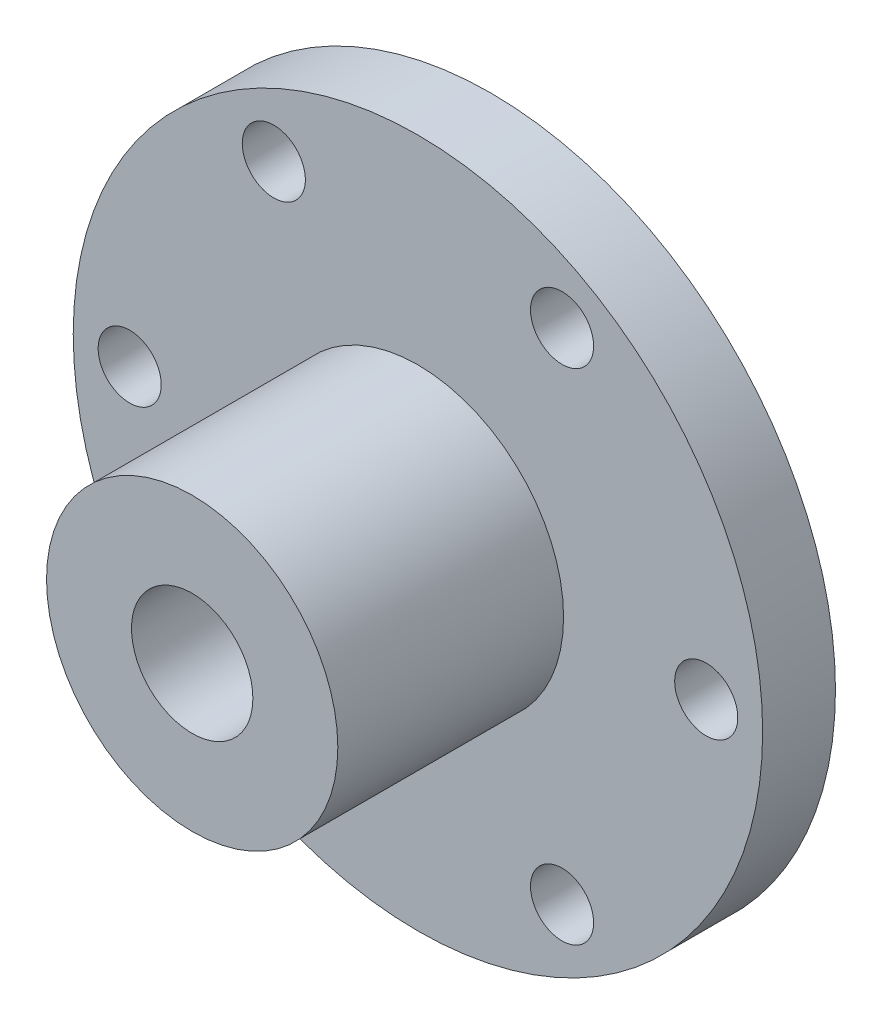
ISO-10303-21;
HEADER;
FILE_DESCRIPTION(('STEP AP214'),'2;1');
FILE_NAME('part.step','',(''),(''),'','','');
FILE_SCHEMA(('AUTOMOTIVE_DESIGN { 1 0 10303 214 1 1 1 1 }'));
ENDSEC;
DATA;
#1=APPLICATION_CONTEXT('core data for automotive mechanical design processes');
#2=APPLICATION_PROTOCOL_DEFINITION('international standard','automotive_design',2000,#1);
#3=PRODUCT_CONTEXT('',#1,'mechanical');
#4=PRODUCT('Part','Part','',(#3));
#5=PRODUCT_RELATED_PRODUCT_CATEGORY('part','',(#4));
#6=PRODUCT_DEFINITION_FORMATION('','',#4);
#7=PRODUCT_DEFINITION_CONTEXT('part definition',#1,'design');
#8=PRODUCT_DEFINITION('design','',#6,#7);
#9=PRODUCT_DEFINITION_SHAPE('','',#8);
#10=(LENGTH_UNIT() NAMED_UNIT(*) SI_UNIT(.MILLI.,.METRE.));
#11=(NAMED_UNIT(*) PLANE_ANGLE_UNIT() SI_UNIT($,.RADIAN.));
#12=(NAMED_UNIT(*) SI_UNIT($,.STERADIAN.) SOLID_ANGLE_UNIT());
#13=UNCERTAINTY_MEASURE_WITH_UNIT(LENGTH_MEASURE(1.E-05),#10,'distance_accuracy_value','');
#14=(GEOMETRIC_REPRESENTATION_CONTEXT(3) GLOBAL_UNCERTAINTY_ASSIGNED_CONTEXT((#13)) GLOBAL_UNIT_ASSIGNED_CONTEXT((#10,
#11,#12)) REPRESENTATION_CONTEXT('',''));
#15=CARTESIAN_POINT('',(0.,0.,0.));
#16=DIRECTION('',(0.,0.,1.));
#17=DIRECTION('',(1.,0.,0.));
#18=AXIS2_PLACEMENT_3D('',#15,#16,#17);
#19=CARTESIAN_POINT('',(0.,0.,0.));
#20=DIRECTION('',(0.,0.,1.));
#21=DIRECTION('',(1.,0.,0.));
#22=AXIS2_PLACEMENT_3D('',#19,#20,#21);
#23=CYLINDRICAL_SURFACE('',#22,5.);
#24=CARTESIAN_POINT('',(0.,-5.,-7.45));
#25=CARTESIAN_POINT('',(0.142778987258238,-4.99999039844045,-7.45001096175151));
#26=CARTESIAN_POINT('',(0.285680641912043,-4.99382130262224,-7.46118493256251));
#27=CARTESIAN_POINT('',(0.567144564535995,-4.96974680203863,-7.50533650142499));
#28=CARTESIAN_POINT('',(0.705700638438619,-4.95182537743962,-7.53834386153926));
#29=CARTESIAN_POINT('',(0.974002318355807,-4.90609520595076,-7.62442420915791));
#30=CARTESIAN_POINT('',(1.10378166320061,-4.87832722648994,-7.67741451835656));
#31=CARTESIAN_POINT('',(1.35234717564264,-4.81535273161602,-7.80146455965426));
#32=CARTESIAN_POINT('',(1.47113287328393,-4.78014589841814,-7.87252506373098));
#33=CARTESIAN_POINT('',(1.70352686090178,-4.70255423205703,-8.0361916310851));
#34=CARTESIAN_POINT('',(1.81621688111275,-4.65984222371037,-8.12994355837125));
#35=CARTESIAN_POINT('',(2.02514431220465,-4.57292248847482,-8.33382166528694));
#36=CARTESIAN_POINT('',(2.12136634262729,-4.52871340903373,-8.44396297444854));
#37=CARTESIAN_POINT('',(2.30419697448828,-4.43869864347795,-8.69036710384133));
#38=CARTESIAN_POINT('',(2.38892451399576,-4.39316476080857,-8.828134362448));
#39=CARTESIAN_POINT('',(2.53369890505088,-4.31130412463234,-9.11874948657494));
#40=CARTESIAN_POINT('',(2.5937652583839,-4.2749701047281,-9.27158531695978));
#41=CARTESIAN_POINT('',(2.66155878256045,-4.23281682608562,-9.50386693192337));
#42=CARTESIAN_POINT('',(2.68014299981511,-4.2210380825709,-9.57919926037609));
#43=CARTESIAN_POINT('',(2.71093428147607,-4.20133009671399,-9.73163327698794));
#44=CARTESIAN_POINT('',(2.72314510987524,-4.1933985824731,-9.80873389267935));
#45=CARTESIAN_POINT('',(2.74096165815425,-4.18177527979981,-9.96394064551219));
#46=CARTESIAN_POINT('',(2.74657370906037,-4.17807942765737,-10.042045746056));
#47=CARTESIAN_POINT('',(2.75111459464714,-4.17508903260052,-10.1985073573553));
#48=CARTESIAN_POINT('',(2.75004434358443,-4.17579388759184,-10.2768638322522));
#49=CARTESIAN_POINT('',(2.73815212102398,-4.18361720654724,-10.487283317475));
#50=CARTESIAN_POINT('',(2.72108205584888,-4.19484451675383,-10.6189068407935));
#51=CARTESIAN_POINT('',(2.66864788710094,-4.22838592901145,-10.8769084684328));
#52=CARTESIAN_POINT('',(2.63327545089908,-4.25070508072784,-11.0032841552061));
#53=CARTESIAN_POINT('',(2.54479294297974,-4.30427056272792,-11.2507966486315));
#54=CARTESIAN_POINT('',(2.49131692713376,-4.33569897011437,-11.3717617857524));
#55=CARTESIAN_POINT('',(2.36845745747105,-4.4040145794537,-11.6036203124031));
#56=CARTESIAN_POINT('',(2.29906713742857,-4.44090413517624,-11.7145093256733));
#57=CARTESIAN_POINT('',(2.13363906053041,-4.52298416705886,-11.9414906618093));
#58=CARTESIAN_POINT('',(2.03512428066292,-4.56856599345175,-12.0556432467646));
#59=CARTESIAN_POINT('',(1.82040889583878,-4.65828959035832,-12.2667111409128));
#60=CARTESIAN_POINT('',(1.70419629159628,-4.7024303589756,-12.3636146576635));
#61=CARTESIAN_POINT('',(1.44767506202423,-4.78786891297331,-12.5436913267541));
#62=CARTESIAN_POINT('',(1.30627310030775,-4.82877747246816,-12.6255077204941));
#63=CARTESIAN_POINT('',(1.00892063152072,-4.89952546955727,-12.7634679362701));
#64=CARTESIAN_POINT('',(0.852983969474416,-4.92937530895885,-12.8196358947936));
#65=CARTESIAN_POINT('',(0.546511729229724,-4.97222242770795,-12.8993536799685));
#66=CARTESIAN_POINT('',(0.396825799792343,-4.9865303795153,-12.9254542483215));
#67=CARTESIAN_POINT('',(0.0945542234833034,-5.00138961122814,-12.9525513853832));
#68=CARTESIAN_POINT('',(-0.0580295079799413,-5.00194968188957,-12.9535639959943));
#69=CARTESIAN_POINT('',(-0.345812295145913,-4.98990296258551,-12.9316091330097));
#70=CARTESIAN_POINT('',(-0.48125297179758,-4.97857765508417,-12.9109756242736));
#71=CARTESIAN_POINT('',(-0.746398071305081,-4.94577990187129,-12.8502623780398));
#72=CARTESIAN_POINT('',(-0.87610191251068,-4.92430642981792,-12.8101806736242));
#73=CARTESIAN_POINT('',(-1.12958905644787,-4.8724896160353,-12.7110704871522));
#74=CARTESIAN_POINT('',(-1.25317389828715,-4.84195785148278,-12.6516365975944));
#75=CARTESIAN_POINT('',(-1.48893850281153,-4.77473698601067,-12.5160483328721));
#76=CARTESIAN_POINT('',(-1.60111407520508,-4.73804563587465,-12.4398878467292));
#77=CARTESIAN_POINT('',(-1.82425828365636,-4.65700524569099,-12.2632564144186));
#78=CARTESIAN_POINT('',(-1.93368607154246,-4.61225876968233,-12.1610184559176));
#79=CARTESIAN_POINT('',(-2.13466254822535,-4.52275844718199,-11.9401353653202));
#80=CARTESIAN_POINT('',(-2.22619259714241,-4.47800464107922,-11.8214733454056));
#81=CARTESIAN_POINT('',(-2.3957983432552,-4.38976013904667,-11.5596883260272));
#82=CARTESIAN_POINT('',(-2.47227629062404,-4.34663770522252,-11.4153811591659));
#83=CARTESIAN_POINT('',(-2.56739683053068,-4.29066766425768,-11.1887888881512));
#84=CARTESIAN_POINT('',(-2.59583862487707,-4.2734625553068,-11.1115650803767));
#85=CARTESIAN_POINT('',(-2.6458317981133,-4.24269216263489,-10.9542353867006));
#86=CARTESIAN_POINT('',(-2.66738800964348,-4.2291243271764,-10.8741315662583));
#87=CARTESIAN_POINT('',(-2.70152034218973,-4.20739315465061,-10.7195546413294));
#88=CARTESIAN_POINT('',(-2.71476195382893,-4.19883483361737,-10.6452834038161));
#89=CARTESIAN_POINT('',(-2.73510919896703,-4.1856093592523,-10.4955974378681));
#90=CARTESIAN_POINT('',(-2.74221831646187,-4.18093999657539,-10.4201833835063));
#91=CARTESIAN_POINT('',(-2.75017846678404,-4.17570870809803,-10.2689144882847));
#92=CARTESIAN_POINT('',(-2.75103252770051,-4.17514479483963,-10.193059878501));
#93=CARTESIAN_POINT('',(-2.74648304684364,-4.17813734540511,-10.0416449123168));
#94=CARTESIAN_POINT('',(-2.74108002102137,-4.18169346949618,-9.96608453216994));
#95=CARTESIAN_POINT('',(-2.71792079638244,-4.19681461420074,-9.76139605484591));
#96=CARTESIAN_POINT('',(-2.69404506306095,-4.21231907452499,-9.63319061594014));
#97=CARTESIAN_POINT('',(-2.62902002771913,-4.25319792148066,-9.3829820527274));
#98=CARTESIAN_POINT('',(-2.58786362989817,-4.27857636225957,-9.26098149937347));
#99=CARTESIAN_POINT('',(-2.48675944463493,-4.3381638166209,-9.01810803378472));
#100=CARTESIAN_POINT('',(-2.42581508415572,-4.37281849448902,-8.89776188369706));
#101=CARTESIAN_POINT('',(-2.28780930960591,-4.44657746410691,-8.66820475297235));
#102=CARTESIAN_POINT('',(-2.21073934259343,-4.48568411212103,-8.55899972744217));
#103=CARTESIAN_POINT('',(-2.02858054035181,-4.57126757702937,-8.33691717159529));
#104=CARTESIAN_POINT('',(-1.92099295581421,-4.61793823071152,-8.22615073379591));
#105=CARTESIAN_POINT('',(-1.68800064207996,-4.70810944527435,-8.02352816344008));
#106=CARTESIAN_POINT('',(-1.56258322887732,-4.75160771572547,-7.9316856081075));
#107=CARTESIAN_POINT('',(-1.2914343421424,-4.83247282242359,-7.76676072269399));
#108=CARTESIAN_POINT('',(-1.14514793520693,-4.86957369387611,-7.69444223381815));
#109=CARTESIAN_POINT('',(-0.916482299020598,-4.91590777051966,-7.60591829368406));
#110=CARTESIAN_POINT('',(-0.838767070819996,-4.92979443010693,-7.57974500606258));
#111=CARTESIAN_POINT('',(-0.680818271016884,-4.95407426627071,-7.53434349241669));
#112=CARTESIAN_POINT('',(-0.600586041524516,-4.96446927117089,-7.51511163128145));
#113=CARTESIAN_POINT('',(-0.434213609351525,-4.98184694584029,-7.48311024834621));
#114=CARTESIAN_POINT('',(-0.347979722788918,-4.98863066804892,-7.47071633691916));
#115=CARTESIAN_POINT('',(-0.174512493715205,-4.99771009739787,-7.45415792174601));
#116=CARTESIAN_POINT('',(-0.0872791656497772,-5.00000586932379,-7.44999329920638));
#117=CARTESIAN_POINT('',(0.,-5.,-7.45));
#118=B_SPLINE_CURVE_WITH_KNOTS('',3,(#24,#25,#26,#27,#28,#29,#30,#31,#32,#33,#34,#35,#36,#37,
#38,#39,#40,#41,#42,#43,#44,#45,#46,#47,#48,#49,#50,#51,#52,#53,#54,#55,#56,#57,#58,#59,#60,#61,
#62,#63,#64,#65,#66,#67,#68,#69,#70,#71,#72,#73,#74,#75,#76,#77,#78,#79,#80,#81,#82,#83,#84,#85,
#86,#87,#88,#89,#90,#91,#92,#93,#94,#95,#96,#97,#98,#99,#100,#101,#102,#103,#104,#105,#106,#107,
#108,#109,#110,#111,#112,#113,#114,#115,#116,#117),.UNSPECIFIED.,.T.,.F.,(4,2,2,2,2,2,2,2,2,2,2,
2,2,2,2,2,2,2,2,2,2,2,2,2,2,2,2,2,2,2,2,2,2,2,2,2,2,2,2,2,2,2,2,2,2,2,4),(0.,0.427998360896545,
0.856581351004706,1.28341021980635,1.71025732624959,2.16646752991302,2.62310151803106,
3.1247230476542,3.62594713307519,3.86107858321706,4.09607101196852,4.33083779887392,
4.56557246625052,4.96309575350149,5.36080018299192,5.7670782124322,6.17353186136941,
6.64411831042721,7.1150252536918,7.61751511067636,8.11953111957603,8.57479050651663,
9.02975878107109,9.44026180419757,9.85080635272649,10.2705736989403,10.6904946609291,
11.1574234989973,11.6248360672095,12.1285624248584,12.3804529335333,12.6321662626343,
12.8596075953027,13.0869196286155,13.3141216123044,13.5413048625532,13.9333695540229,
14.3255953931019,14.7418450996639,15.1583161452215,15.6401170917653,16.12226251914,
16.6211820135536,16.8703635147898,17.11941433379,17.381048624724,17.6426791388203),.UNSPECIFIED.);
#119=CARTESIAN_POINT('',(0.,-5.,-7.45));
#120=VERTEX_POINT('',#119);
#121=EDGE_CURVE('E153',#120,#120,#118,.T.);
#122=ORIENTED_EDGE('',*,*,#121,.F.);
#123=EDGE_LOOP('',(#122));
#124=FACE_BOUND('',#123,.T.);
#125=CARTESIAN_POINT('',(0.,0.,-24.6));
#126=DIRECTION('',(0.,0.,1.));
#127=DIRECTION('',(1.,0.,0.));
#128=AXIS2_PLACEMENT_3D('',#125,#126,#127);
#129=CIRCLE('',#128,5.);
#130=CARTESIAN_POINT('',(5.,0.,-24.6));
#131=VERTEX_POINT('',#130);
#132=EDGE_CURVE('E10',#131,#131,#129,.T.);
#133=ORIENTED_EDGE('',*,*,#132,.F.);
#134=EDGE_LOOP('',(#133));
#135=FACE_BOUND('',#134,.T.);
#136=CARTESIAN_POINT('',(0.,0.,0.));
#137=DIRECTION('',(0.,0.,1.));
#138=DIRECTION('',(1.,0.,0.));
#139=AXIS2_PLACEMENT_3D('',#136,#137,#138);
#140=CIRCLE('',#139,5.);
#141=CARTESIAN_POINT('',(5.,0.,0.));
#142=VERTEX_POINT('',#141);
#143=EDGE_CURVE('E68',#142,#142,#140,.T.);
#144=ORIENTED_EDGE('',*,*,#143,.T.);
#145=EDGE_LOOP('',(#144));
#146=FACE_BOUND('',#145,.T.);
#147=ADVANCED_FACE('F35',(#124,#135,#146),#23,.F.);
#148=CARTESIAN_POINT('',(-5.,0.,-24.6));
#149=DIRECTION('',(0.,0.,1.));
#150=DIRECTION('',(1.,0.,0.));
#151=AXIS2_PLACEMENT_3D('',#148,#149,#150);
#152=PLANE('',#151);
#153=CARTESIAN_POINT('',(23.75,0.,-24.6));
#154=DIRECTION('',(0.,0.,-1.));
#155=DIRECTION('',(-1.,0.,0.));
#156=AXIS2_PLACEMENT_3D('',#153,#154,#155);
#157=CIRCLE('',#156,2.6);
#158=CARTESIAN_POINT('',(21.15,0.,-24.6));
#159=VERTEX_POINT('',#158);
#160=EDGE_CURVE('E55',#159,#159,#157,.T.);
#161=ORIENTED_EDGE('',*,*,#160,.F.);
#162=EDGE_LOOP('',(#161));
#163=FACE_BOUND('',#162,.T.);
#164=CARTESIAN_POINT('',(11.8750000000002,-20.5681033398803,-24.6));
#165=DIRECTION('',(0.,0.,-1.));
#166=DIRECTION('',(-1.,0.,0.));
#167=AXIS2_PLACEMENT_3D('',#164,#165,#166);
#168=CIRCLE('',#167,2.6);
#169=CARTESIAN_POINT('',(9.27500000000024,-20.5681033398803,-24.6));
#170=VERTEX_POINT('',#169);
#171=EDGE_CURVE('E159',#170,#170,#168,.T.);
#172=ORIENTED_EDGE('',*,*,#171,.F.);
#173=EDGE_LOOP('',(#172));
#174=FACE_BOUND('',#173,.T.);
#175=CARTESIAN_POINT('',(-11.8749999999998,-20.5681033398805,-24.6));
#176=DIRECTION('',(0.,0.,-1.));
#177=DIRECTION('',(-1.,0.,0.));
#178=AXIS2_PLACEMENT_3D('',#175,#176,#177);
#179=CIRCLE('',#178,2.6);
#180=CARTESIAN_POINT('',(-14.4749999999998,-20.5681033398805,-24.6));
#181=VERTEX_POINT('',#180);
#182=EDGE_CURVE('E80',#181,#181,#179,.T.);
#183=ORIENTED_EDGE('',*,*,#182,.F.);
#184=EDGE_LOOP('',(#183));
#185=FACE_BOUND('',#184,.T.);
#186=CARTESIAN_POINT('',(-23.75,-1.65845363595049E-13,-24.6));
#187=DIRECTION('',(0.,0.,-1.));
#188=DIRECTION('',(-1.,0.,0.));
#189=AXIS2_PLACEMENT_3D('',#186,#187,#188);
#190=CIRCLE('',#189,2.6);
#191=CARTESIAN_POINT('',(-26.35,-1.65845363595049E-13,-24.6));
#192=VERTEX_POINT('',#191);
#193=EDGE_CURVE('E169',#192,#192,#190,.T.);
#194=ORIENTED_EDGE('',*,*,#193,.F.);
#195=EDGE_LOOP('',(#194));
#196=FACE_BOUND('',#195,.T.);
#197=CARTESIAN_POINT('',(-11.8750000000001,20.5681033398804,-24.6));
#198=DIRECTION('',(0.,0.,-1.));
#199=DIRECTION('',(-1.,0.,0.));
#200=AXIS2_PLACEMENT_3D('',#197,#198,#199);
#201=CIRCLE('',#200,2.6);
#202=CARTESIAN_POINT('',(-14.4750000000001,20.5681033398804,-24.6));
#203=VERTEX_POINT('',#202);
#204=EDGE_CURVE('E167',#203,#203,#201,.T.);
#205=ORIENTED_EDGE('',*,*,#204,.F.);
#206=EDGE_LOOP('',(#205));
#207=FACE_BOUND('',#206,.T.);
#208=CARTESIAN_POINT('',(11.875,20.5681033398804,-24.6));
#209=DIRECTION('',(0.,0.,-1.));
#210=DIRECTION('',(-1.,0.,0.));
#211=AXIS2_PLACEMENT_3D('',#208,#209,#210);
#212=CIRCLE('',#211,2.6);
#213=CARTESIAN_POINT('',(9.27499999999996,20.5681033398804,-24.6));
#214=VERTEX_POINT('',#213);
#215=EDGE_CURVE('E162',#214,#214,#212,.T.);
#216=ORIENTED_EDGE('',*,*,#215,.F.);
#217=EDGE_LOOP('',(#216));
#218=FACE_BOUND('',#217,.T.);
#219=CARTESIAN_POINT('',(0.,0.,-24.6));
#220=DIRECTION('',(0.,0.,1.));
#221=DIRECTION('',(1.,0.,0.));
#222=AXIS2_PLACEMENT_3D('',#219,#220,#221);
#223=CIRCLE('',#222,28.4);
#224=CARTESIAN_POINT('',(28.4,0.,-24.6));
#225=VERTEX_POINT('',#224);
#226=EDGE_CURVE('E42',#225,#225,#223,.T.);
#227=ORIENTED_EDGE('',*,*,#226,.F.);
#228=EDGE_LOOP('',(#227));
#229=FACE_BOUND('',#228,.T.);
#230=ORIENTED_EDGE('',*,*,#132,.T.);
#231=EDGE_LOOP('',(#230));
#232=FACE_BOUND('',#231,.T.);
#233=ADVANCED_FACE('F92',(#163,#174,#185,#196,#207,#218,#229,#232),#152,.F.);
#234=CARTESIAN_POINT('',(0.,0.,0.));
#235=DIRECTION('',(0.,0.,1.));
#236=DIRECTION('',(1.,0.,0.));
#237=AXIS2_PLACEMENT_3D('',#234,#235,#236);
#238=CYLINDRICAL_SURFACE('',#237,28.4);
#239=CARTESIAN_POINT('',(0.,0.,-18.6));
#240=DIRECTION('',(0.,0.,1.));
#241=DIRECTION('',(1.,0.,0.));
#242=AXIS2_PLACEMENT_3D('',#239,#240,#241);
#243=CIRCLE('',#242,28.4);
#244=CARTESIAN_POINT('',(28.4,0.,-18.6));
#245=VERTEX_POINT('',#244);
#246=EDGE_CURVE('E47',#245,#245,#243,.T.);
#247=ORIENTED_EDGE('',*,*,#246,.F.);
#248=EDGE_LOOP('',(#247));
#249=FACE_BOUND('',#248,.T.);
#250=ORIENTED_EDGE('',*,*,#226,.T.);
#251=EDGE_LOOP('',(#250));
#252=FACE_BOUND('',#251,.T.);
#253=ADVANCED_FACE('F89',(#249,#252),#238,.T.);
#254=CARTESIAN_POINT('',(-28.4,0.,-18.6));
#255=DIRECTION('',(0.,0.,-1.));
#256=DIRECTION('',(-1.,0.,0.));
#257=AXIS2_PLACEMENT_3D('',#254,#255,#256);
#258=PLANE('',#257);
#259=CARTESIAN_POINT('',(23.75,0.,-18.6));
#260=DIRECTION('',(0.,0.,-1.));
#261=DIRECTION('',(-1.,0.,0.));
#262=AXIS2_PLACEMENT_3D('',#259,#260,#261);
#263=CIRCLE('',#262,2.6);
#264=CARTESIAN_POINT('',(21.15,0.,-18.6));
#265=VERTEX_POINT('',#264);
#266=EDGE_CURVE('E38',#265,#265,#263,.T.);
#267=ORIENTED_EDGE('',*,*,#266,.T.);
#268=EDGE_LOOP('',(#267));
#269=FACE_BOUND('',#268,.T.);
#270=CARTESIAN_POINT('',(11.8750000000002,-20.5681033398803,-18.6));
#271=DIRECTION('',(0.,0.,-1.));
#272=DIRECTION('',(-1.,0.,0.));
#273=AXIS2_PLACEMENT_3D('',#270,#271,#272);
#274=CIRCLE('',#273,2.6);
#275=CARTESIAN_POINT('',(9.27500000000024,-20.5681033398803,-18.6));
#276=VERTEX_POINT('',#275);
#277=EDGE_CURVE('E63',#276,#276,#274,.T.);
#278=ORIENTED_EDGE('',*,*,#277,.T.);
#279=EDGE_LOOP('',(#278));
#280=FACE_BOUND('',#279,.T.);
#281=CARTESIAN_POINT('',(-11.8749999999998,-20.5681033398805,-18.6));
#282=DIRECTION('',(0.,0.,-1.));
#283=DIRECTION('',(-1.,0.,0.));
#284=AXIS2_PLACEMENT_3D('',#281,#282,#283);
#285=CIRCLE('',#284,2.6);
#286=CARTESIAN_POINT('',(-14.4749999999998,-20.5681033398805,-18.6));
#287=VERTEX_POINT('',#286);
#288=EDGE_CURVE('E61',#287,#287,#285,.T.);
#289=ORIENTED_EDGE('',*,*,#288,.T.);
#290=EDGE_LOOP('',(#289));
#291=FACE_BOUND('',#290,.T.);
#292=CARTESIAN_POINT('',(-23.75,-1.65845363595049E-13,-18.6));
#293=DIRECTION('',(0.,0.,-1.));
#294=DIRECTION('',(-1.,0.,0.));
#295=AXIS2_PLACEMENT_3D('',#292,#293,#294);
#296=CIRCLE('',#295,2.6);
#297=CARTESIAN_POINT('',(-26.35,-1.65845363595049E-13,-18.6));
#298=VERTEX_POINT('',#297);
#299=EDGE_CURVE('E58',#298,#298,#296,.T.);
#300=ORIENTED_EDGE('',*,*,#299,.T.);
#301=EDGE_LOOP('',(#300));
#302=FACE_BOUND('',#301,.T.);
#303=CARTESIAN_POINT('',(-11.8750000000001,20.5681033398804,-18.6));
#304=DIRECTION('',(0.,0.,-1.));
#305=DIRECTION('',(-1.,0.,0.));
#306=AXIS2_PLACEMENT_3D('',#303,#304,#305);
#307=CIRCLE('',#306,2.6);
#308=CARTESIAN_POINT('',(-14.4750000000001,20.5681033398804,-18.6));
#309=VERTEX_POINT('',#308);
#310=EDGE_CURVE('E54',#309,#309,#307,.T.);
#311=ORIENTED_EDGE('',*,*,#310,.T.);
#312=EDGE_LOOP('',(#311));
#313=FACE_BOUND('',#312,.T.);
#314=CARTESIAN_POINT('',(11.875,20.5681033398804,-18.6));
#315=DIRECTION('',(0.,0.,-1.));
#316=DIRECTION('',(-1.,0.,0.));
#317=AXIS2_PLACEMENT_3D('',#314,#315,#316);
#318=CIRCLE('',#317,2.6);
#319=CARTESIAN_POINT('',(9.27499999999996,20.5681033398804,-18.6));
#320=VERTEX_POINT('',#319);
#321=EDGE_CURVE('E51',#320,#320,#318,.T.);
#322=ORIENTED_EDGE('',*,*,#321,.T.);
#323=EDGE_LOOP('',(#322));
#324=FACE_BOUND('',#323,.T.);
#325=CARTESIAN_POINT('',(0.,0.,-18.6));
#326=DIRECTION('',(0.,0.,1.));
#327=DIRECTION('',(1.,0.,0.));
#328=AXIS2_PLACEMENT_3D('',#325,#326,#327);
#329=CIRCLE('',#328,12.);
#330=CARTESIAN_POINT('',(12.,0.,-18.6));
#331=VERTEX_POINT('',#330);
#332=EDGE_CURVE('E77',#331,#331,#329,.T.);
#333=ORIENTED_EDGE('',*,*,#332,.F.);
#334=EDGE_LOOP('',(#333));
#335=FACE_BOUND('',#334,.T.);
#336=ORIENTED_EDGE('',*,*,#246,.T.);
#337=EDGE_LOOP('',(#336));
#338=FACE_BOUND('',#337,.T.);
#339=ADVANCED_FACE('F87',(#269,#280,#291,#302,#313,#324,#335,#338),#258,.F.);
#340=CARTESIAN_POINT('',(0.,0.,0.));
#341=DIRECTION('',(0.,0.,1.));
#342=DIRECTION('',(1.,0.,0.));
#343=AXIS2_PLACEMENT_3D('',#340,#341,#342);
#344=CYLINDRICAL_SURFACE('',#343,12.);
#345=CARTESIAN_POINT('',(0.,-12.,-7.45));
#346=CARTESIAN_POINT('',(-0.15233566511251,-11.9999972315175,-7.45000493216484));
#347=CARTESIAN_POINT('',(-0.304729405495085,-11.9970699348416,-7.46270059921498));
#348=CARTESIAN_POINT('',(-0.605175685203656,-11.9856753790477,-7.51308768288144));
#349=CARTESIAN_POINT('',(-0.753225259292202,-11.9772044238136,-7.55079577622717));
#350=CARTESIAN_POINT('',(-1.04059881543838,-11.9556640877291,-7.64995473745562));
#351=CARTESIAN_POINT('',(-1.17993216044836,-11.9425997445875,-7.71137960164666));
#352=CARTESIAN_POINT('',(-1.44631273101013,-11.9132766335863,-7.85614300368023));
#353=CARTESIAN_POINT('',(-1.57336003506928,-11.8970178861408,-7.93948140148338));
#354=CARTESIAN_POINT('',(-1.81379033682122,-11.8627636061092,-8.12724985937119));
#355=CARTESIAN_POINT('',(-1.92692739646985,-11.8447448071874,-8.23199061331544));
#356=CARTESIAN_POINT('',(-2.13419150086585,-11.8091621283549,-8.45892414874661));
#357=CARTESIAN_POINT('',(-2.22831671486324,-11.7915982923969,-8.58111860900982));
#358=CARTESIAN_POINT('',(-2.39599314324079,-11.7586832354517,-8.84133848650177));
#359=CARTESIAN_POINT('',(-2.46927829059603,-11.7433617443749,-8.97953944613383));
#360=CARTESIAN_POINT('',(-2.59148624548274,-11.7170019003287,-9.26670515629337));
#361=CARTESIAN_POINT('',(-2.64041227426921,-11.7059629810738,-9.41566848061845));
#362=CARTESIAN_POINT('',(-2.71169193078237,-11.689655850568,-9.71745044015126));
#363=CARTESIAN_POINT('',(-2.73448322194604,-11.6842927118809,-9.87016045880171));
#364=CARTESIAN_POINT('',(-2.75420810145758,-11.6796595983391,-10.1773235016435));
#365=CARTESIAN_POINT('',(-2.75114519176791,-11.6803887982743,-10.3317762869461));
#366=CARTESIAN_POINT('',(-2.71959985080367,-11.6877722199585,-10.6347552529579));
#367=CARTESIAN_POINT('',(-2.69162995059856,-11.6943069699553,-10.7833381539248));
#368=CARTESIAN_POINT('',(-2.61187838218716,-11.7123758237895,-11.073644812551));
#369=CARTESIAN_POINT('',(-2.56009526166011,-11.7239102325437,-11.2153681512764));
#370=CARTESIAN_POINT('',(-2.43372753254849,-11.7507938940467,-11.4893521448476));
#371=CARTESIAN_POINT('',(-2.35894941662191,-11.7661753067557,-11.6215202623272));
#372=CARTESIAN_POINT('',(-2.18885018488213,-11.7990006694124,-11.8716203401476));
#373=CARTESIAN_POINT('',(-2.09352601142639,-11.8164449261757,-11.989550177483));
#374=CARTESIAN_POINT('',(-1.88234606609736,-11.8519400280581,-12.2107727015));
#375=CARTESIAN_POINT('',(-1.76605549159834,-11.869995426811,-12.3136500389346));
#376=CARTESIAN_POINT('',(-1.51766349529507,-11.9043014002117,-12.4985137856671));
#377=CARTESIAN_POINT('',(-1.38556173020446,-11.9205519356583,-12.5804997412586));
#378=CARTESIAN_POINT('',(-1.108762982677,-11.9494783161917,-12.7213717740407));
#379=CARTESIAN_POINT('',(-0.964035176837912,-11.9621450736592,-12.780199271922));
#380=CARTESIAN_POINT('',(-0.666392599354057,-11.9824097411606,-12.8725814459019));
#381=CARTESIAN_POINT('',(-0.513479141663044,-11.9900084620915,-12.9061401651711));
#382=CARTESIAN_POINT('',(-0.207364892656089,-11.99916399391,-12.9464184311536));
#383=CARTESIAN_POINT('',(-0.0542423914346353,-12.0008483769449,-12.9537047670185));
#384=CARTESIAN_POINT('',(0.25103228809823,-11.9983448123514,-12.9427735361375));
#385=CARTESIAN_POINT('',(0.403184538168025,-11.9941573041806,-12.9245578779837));
#386=CARTESIAN_POINT('',(0.700292389287878,-11.9804613895508,-12.86360896912));
#387=CARTESIAN_POINT('',(0.845313042678223,-11.9710183651889,-12.8211768255973));
#388=CARTESIAN_POINT('',(1.12617632471418,-11.947870189284,-12.7133367516851));
#389=CARTESIAN_POINT('',(1.2620181195744,-11.9341646511763,-12.6479267373777));
#390=CARTESIAN_POINT('',(1.52298318383199,-11.9036996064929,-12.4948333383013));
#391=CARTESIAN_POINT('',(1.64790878515787,-11.8868962509689,-12.4068219309637));
#392=CARTESIAN_POINT('',(1.88142064830582,-11.8521819485343,-12.2114518571991));
#393=CARTESIAN_POINT('',(1.99000456160873,-11.834270842946,-12.104090414776));
#394=CARTESIAN_POINT('',(2.19002251098739,-11.7989130051408,-11.8704561423996));
#395=CARTESIAN_POINT('',(2.28106228238595,-11.7814831567831,-11.7438427258713));
#396=CARTESIAN_POINT('',(2.44059144036504,-11.7494748801815,-11.4767930398386));
#397=CARTESIAN_POINT('',(2.50908182719841,-11.7348963254706,-11.3363573838245));
#398=CARTESIAN_POINT('',(2.62108536841545,-11.7103885820723,-11.0464147751564));
#399=CARTESIAN_POINT('',(2.66474318092349,-11.7004325295147,-10.8969660881953));
#400=CARTESIAN_POINT('',(2.72625486941496,-11.6862547114241,-10.5925934671388));
#401=CARTESIAN_POINT('',(2.74411334199904,-11.6820319244183,-10.4376705134193));
#402=CARTESIAN_POINT('',(2.75330912915933,-11.6798675366655,-10.1307333614075));
#403=CARTESIAN_POINT('',(2.74527303430362,-11.6817775323155,-9.9787386537819));
#404=CARTESIAN_POINT('',(2.70431923414121,-11.691325474724,-9.67833193655201));
#405=CARTESIAN_POINT('',(2.67140188354571,-11.698963339825,-9.5299198759041));
#406=CARTESIAN_POINT('',(2.58193582455069,-11.7190306634045,-9.24144778980269));
#407=CARTESIAN_POINT('',(2.52548676756217,-11.7314398992108,-9.10135535757835));
#408=CARTESIAN_POINT('',(2.3906423278447,-11.7596578771078,-8.83253947052719));
#409=CARTESIAN_POINT('',(2.31224440621038,-11.7754670124282,-8.70381733321132));
#410=CARTESIAN_POINT('',(2.13368599928877,-11.8091403781452,-8.45832630468422));
#411=CARTESIAN_POINT('',(2.03308265003611,-11.8270423197489,-8.34188464383953));
#412=CARTESIAN_POINT('',(1.81385586966114,-11.8626403293393,-8.12733120703348));
#413=CARTESIAN_POINT('',(1.69522825143271,-11.8803363484585,-8.0292237020058));
#414=CARTESIAN_POINT('',(1.44123871730058,-11.9138347410865,-7.85274797045412));
#415=CARTESIAN_POINT('',(1.30565844628411,-11.9296058185084,-7.77468769425678));
#416=CARTESIAN_POINT('',(1.02296229242021,-11.9571588343972,-7.6425896055195));
#417=CARTESIAN_POINT('',(0.87585575381058,-11.9689439638548,-7.58853256604773));
#418=CARTESIAN_POINT('',(0.607269853203754,-11.9852080140365,-7.51510209005777));
#419=CARTESIAN_POINT('',(0.487192564150981,-11.9907194825834,-7.49073729716507));
#420=CARTESIAN_POINT('',(0.244755932857372,-11.9981164916396,-7.4581846995481));
#421=CARTESIAN_POINT('',(0.122396711951547,-12.0000022243849,-7.44999603716727));
#422=CARTESIAN_POINT('',(0.,-12.,-7.45));
#423=B_SPLINE_CURVE_WITH_KNOTS('',3,(#345,#346,#347,#348,#349,#350,#351,#352,#353,#354,#355,
#356,#357,#358,#359,#360,#361,#362,#363,#364,#365,#366,#367,#368,#369,#370,#371,#372,#373,#374,
#375,#376,#377,#378,#379,#380,#381,#382,#383,#384,#385,#386,#387,#388,#389,#390,#391,#392,#393,
#394,#395,#396,#397,#398,#399,#400,#401,#402,#403,#404,#405,#406,#407,#408,#409,#410,#411,#412,
#413,#414,#415,#416,#417,#418,#419,#420,#421,#422),.UNSPECIFIED.,.T.,.F.,(4,2,2,2,2,2,2,2,2,2,2,
2,2,2,2,2,2,2,2,2,2,2,2,2,2,2,2,2,2,2,2,2,2,2,2,2,2,2,4),(0.,0.456558813177757,
0.913422337748372,1.36978636108598,1.82614746808077,2.28967583671584,2.75324881966273,
3.2224987656513,3.69168664143448,4.15289696257425,4.61404481358294,5.06591707096829,
5.51781689079591,5.97362871815734,6.42950842584581,6.89624223245662,7.3629861744473,
7.8309032734404,8.29874548670461,8.75643217725427,9.21408461595209,9.66616687104138,
10.1182901371391,10.5773878259209,11.0365514303067,11.5050653496005,11.9735584836025,
12.4392937766026,12.9049460805305,13.3594160292346,13.8138794990641,14.2664376620997,
14.7190481958364,15.1816664103843,15.6443922576757,16.1138502380794,16.5829314946402,
16.9497809816642,17.316611017849),.UNSPECIFIED.);
#424=CARTESIAN_POINT('',(0.,-12.,-7.45));
#425=VERTEX_POINT('',#424);
#426=EDGE_CURVE('E148',#425,#425,#423,.T.);
#427=ORIENTED_EDGE('',*,*,#426,.F.);
#428=EDGE_LOOP('',(#427));
#429=FACE_BOUND('',#428,.T.);
#430=CARTESIAN_POINT('',(0.,0.,0.));
#431=DIRECTION('',(0.,0.,1.));
#432=DIRECTION('',(1.,0.,0.));
#433=AXIS2_PLACEMENT_3D('',#430,#431,#432);
#434=CIRCLE('',#433,12.);
#435=CARTESIAN_POINT('',(12.,0.,0.));
#436=VERTEX_POINT('',#435);
#437=EDGE_CURVE('E72',#436,#436,#434,.T.);
#438=ORIENTED_EDGE('',*,*,#437,.F.);
#439=EDGE_LOOP('',(#438));
#440=FACE_BOUND('',#439,.T.);
#441=ORIENTED_EDGE('',*,*,#332,.T.);
#442=EDGE_LOOP('',(#441));
#443=FACE_BOUND('',#442,.T.);
#444=ADVANCED_FACE('F108',(#429,#440,#443),#344,.T.);
#445=CARTESIAN_POINT('',(-12.,0.,0.));
#446=DIRECTION('',(0.,0.,-1.));
#447=DIRECTION('',(-1.,0.,0.));
#448=AXIS2_PLACEMENT_3D('',#445,#446,#447);
#449=PLANE('',#448);
#450=ORIENTED_EDGE('',*,*,#143,.F.);
#451=EDGE_LOOP('',(#450));
#452=FACE_BOUND('',#451,.T.);
#453=ORIENTED_EDGE('',*,*,#437,.T.);
#454=EDGE_LOOP('',(#453));
#455=FACE_BOUND('',#454,.T.);
#456=ADVANCED_FACE('F111',(#452,#455),#449,.F.);
#457=CARTESIAN_POINT('',(11.875,20.5681033398804,0.));
#458=DIRECTION('',(0.,0.,-1.));
#459=DIRECTION('',(-1.,0.,0.));
#460=AXIS2_PLACEMENT_3D('',#457,#458,#459);
#461=CYLINDRICAL_SURFACE('',#460,2.6);
#462=ORIENTED_EDGE('',*,*,#215,.T.);
#463=EDGE_LOOP('',(#462));
#464=FACE_BOUND('',#463,.T.);
#465=ORIENTED_EDGE('',*,*,#321,.F.);
#466=EDGE_LOOP('',(#465));
#467=FACE_BOUND('',#466,.T.);
#468=ADVANCED_FACE('F114',(#464,#467),#461,.F.);
#469=CARTESIAN_POINT('',(-11.8750000000001,20.5681033398804,0.));
#470=DIRECTION('',(0.,0.,-1.));
#471=DIRECTION('',(-1.,0.,0.));
#472=AXIS2_PLACEMENT_3D('',#469,#470,#471);
#473=CYLINDRICAL_SURFACE('',#472,2.6);
#474=ORIENTED_EDGE('',*,*,#204,.T.);
#475=EDGE_LOOP('',(#474));
#476=FACE_BOUND('',#475,.T.);
#477=ORIENTED_EDGE('',*,*,#310,.F.);
#478=EDGE_LOOP('',(#477));
#479=FACE_BOUND('',#478,.T.);
#480=ADVANCED_FACE('F124',(#476,#479),#473,.F.);
#481=CARTESIAN_POINT('',(-23.75,-1.65845363595049E-13,0.));
#482=DIRECTION('',(0.,0.,-1.));
#483=DIRECTION('',(-1.,0.,0.));
#484=AXIS2_PLACEMENT_3D('',#481,#482,#483);
#485=CYLINDRICAL_SURFACE('',#484,2.6);
#486=ORIENTED_EDGE('',*,*,#193,.T.);
#487=EDGE_LOOP('',(#486));
#488=FACE_BOUND('',#487,.T.);
#489=ORIENTED_EDGE('',*,*,#299,.F.);
#490=EDGE_LOOP('',(#489));
#491=FACE_BOUND('',#490,.T.);
#492=ADVANCED_FACE('F120',(#488,#491),#485,.F.);
#493=CARTESIAN_POINT('',(-11.8749999999998,-20.5681033398805,0.));
#494=DIRECTION('',(0.,0.,-1.));
#495=DIRECTION('',(-1.,0.,0.));
#496=AXIS2_PLACEMENT_3D('',#493,#494,#495);
#497=CYLINDRICAL_SURFACE('',#496,2.6);
#498=ORIENTED_EDGE('',*,*,#182,.T.);
#499=EDGE_LOOP('',(#498));
#500=FACE_BOUND('',#499,.T.);
#501=ORIENTED_EDGE('',*,*,#288,.F.);
#502=EDGE_LOOP('',(#501));
#503=FACE_BOUND('',#502,.T.);
#504=ADVANCED_FACE('F116',(#500,#503),#497,.F.);
#505=CARTESIAN_POINT('',(11.8750000000002,-20.5681033398803,0.));
#506=DIRECTION('',(0.,0.,-1.));
#507=DIRECTION('',(-1.,0.,0.));
#508=AXIS2_PLACEMENT_3D('',#505,#506,#507);
#509=CYLINDRICAL_SURFACE('',#508,2.6);
#510=ORIENTED_EDGE('',*,*,#171,.T.);
#511=EDGE_LOOP('',(#510));
#512=FACE_BOUND('',#511,.T.);
#513=ORIENTED_EDGE('',*,*,#277,.F.);
#514=EDGE_LOOP('',(#513));
#515=FACE_BOUND('',#514,.T.);
#516=ADVANCED_FACE('F119',(#512,#515),#509,.F.);
#517=CARTESIAN_POINT('',(23.75,0.,0.));
#518=DIRECTION('',(0.,0.,-1.));
#519=DIRECTION('',(-1.,0.,0.));
#520=AXIS2_PLACEMENT_3D('',#517,#518,#519);
#521=CYLINDRICAL_SURFACE('',#520,2.6);
#522=ORIENTED_EDGE('',*,*,#160,.T.);
#523=EDGE_LOOP('',(#522));
#524=FACE_BOUND('',#523,.T.);
#525=ORIENTED_EDGE('',*,*,#266,.F.);
#526=EDGE_LOOP('',(#525));
#527=FACE_BOUND('',#526,.T.);
#528=ADVANCED_FACE('F134',(#524,#527),#521,.F.);
#529=CARTESIAN_POINT('',(0.,-28.401,-10.2));
#530=DIRECTION('',(0.,1.,0.));
#531=DIRECTION('',(0.,0.,1.));
#532=AXIS2_PLACEMENT_3D('',#529,#530,#531);
#533=CYLINDRICAL_SURFACE('',#532,2.75);
#534=ORIENTED_EDGE('',*,*,#426,.T.);
#535=EDGE_LOOP('',(#534));
#536=FACE_BOUND('',#535,.T.);
#537=ORIENTED_EDGE('',*,*,#121,.T.);
#538=EDGE_LOOP('',(#537));
#539=FACE_BOUND('',#538,.T.);
#540=ADVANCED_FACE('F138',(#536,#539),#533,.F.);
#541=CLOSED_SHELL('',(#147,#233,#253,#339,#444,#456,#468,#480,#492,#504,#516,#528,#540));
#542=MANIFOLD_SOLID_BREP('B2',#541);
#543=ADVANCED_BREP_SHAPE_REPRESENTATION('',(#18,#542),#14);
#544=SHAPE_DEFINITION_REPRESENTATION(#9,#543);
ENDSEC;
END-ISO-10303-21;
